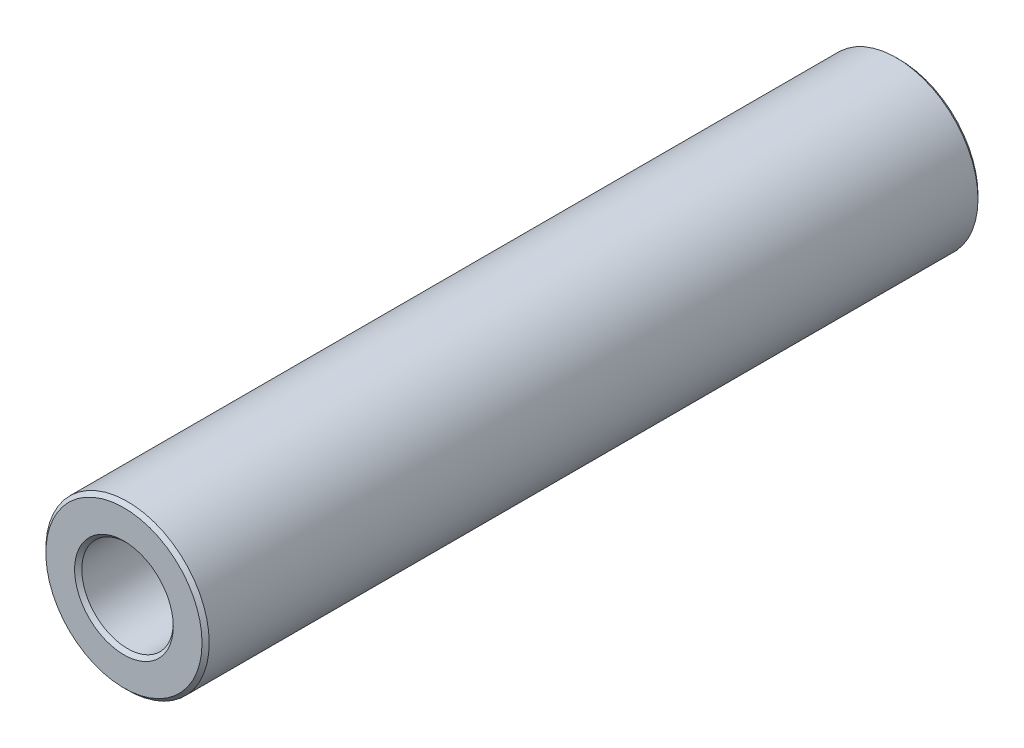
ISO-10303-21;
HEADER;
FILE_DESCRIPTION(('STEP AP214'),'2;1');
FILE_NAME('part.step','',(''),(''),'','','');
FILE_SCHEMA(('AUTOMOTIVE_DESIGN { 1 0 10303 214 1 1 1 1 }'));
ENDSEC;
DATA;
#1=APPLICATION_CONTEXT('core data for automotive mechanical design processes');
#2=APPLICATION_PROTOCOL_DEFINITION('international standard','automotive_design',2000,#1);
#3=PRODUCT_CONTEXT('',#1,'mechanical');
#4=PRODUCT('Part','Part','',(#3));
#5=PRODUCT_RELATED_PRODUCT_CATEGORY('part','',(#4));
#6=PRODUCT_DEFINITION_FORMATION('','',#4);
#7=PRODUCT_DEFINITION_CONTEXT('part definition',#1,'design');
#8=PRODUCT_DEFINITION('design','',#6,#7);
#9=PRODUCT_DEFINITION_SHAPE('','',#8);
#10=(LENGTH_UNIT() NAMED_UNIT(*) SI_UNIT(.MILLI.,.METRE.));
#11=(NAMED_UNIT(*) PLANE_ANGLE_UNIT() SI_UNIT($,.RADIAN.));
#12=(NAMED_UNIT(*) SI_UNIT($,.STERADIAN.) SOLID_ANGLE_UNIT());
#13=UNCERTAINTY_MEASURE_WITH_UNIT(LENGTH_MEASURE(1.E-05),#10,'distance_accuracy_value','');
#14=(GEOMETRIC_REPRESENTATION_CONTEXT(3) GLOBAL_UNCERTAINTY_ASSIGNED_CONTEXT((#13)) GLOBAL_UNIT_ASSIGNED_CONTEXT((#10,
#11,#12)) REPRESENTATION_CONTEXT('',''));
#15=CARTESIAN_POINT('',(0.,0.,0.));
#16=DIRECTION('',(0.,0.,1.));
#17=DIRECTION('',(1.,0.,0.));
#18=AXIS2_PLACEMENT_3D('',#15,#16,#17);
#19=CARTESIAN_POINT('',(0.,0.,-15.08125));
#20=DIRECTION('',(0.,0.,1.));
#21=DIRECTION('',(1.,0.,0.));
#22=AXIS2_PLACEMENT_3D('',#19,#20,#21);
#23=CYLINDRICAL_SURFACE('',#22,3.175);
#24=CARTESIAN_POINT('',(0.,0.,14.94155));
#25=DIRECTION('',(0.,0.,1.));
#26=DIRECTION('',(1.,0.,0.));
#27=AXIS2_PLACEMENT_3D('',#24,#25,#26);
#28=CIRCLE('',#27,3.175);
#29=CARTESIAN_POINT('',(3.175,0.,14.94155));
#30=VERTEX_POINT('',#29);
#31=EDGE_CURVE('E64',#30,#30,#28,.F.);
#32=CARTESIAN_POINT('',(0.,0.,-14.94155));
#33=DIRECTION('',(0.,0.,1.));
#34=DIRECTION('',(1.,0.,0.));
#35=AXIS2_PLACEMENT_3D('',#32,#33,#34);
#36=CIRCLE('',#35,3.175);
#37=CARTESIAN_POINT('',(3.175,0.,-14.94155));
#38=VERTEX_POINT('',#37);
#39=EDGE_CURVE('E68',#38,#38,#36,.T.);
#40=CARTESIAN_POINT('',(3.175,0.,14.94155));
#41=CARTESIAN_POINT('',(3.175,0.,14.6302677083333));
#42=CARTESIAN_POINT('',(3.175,0.,14.3189854166667));
#43=CARTESIAN_POINT('',(3.175,0.,13.6964208333333));
#44=CARTESIAN_POINT('',(3.175,0.,13.3851385416667));
#45=CARTESIAN_POINT('',(3.175,0.,12.7625739583333));
#46=CARTESIAN_POINT('',(3.175,0.,12.4512916666667));
#47=CARTESIAN_POINT('',(3.175,0.,11.8287270833333));
#48=CARTESIAN_POINT('',(3.175,0.,11.5174447916667));
#49=CARTESIAN_POINT('',(3.175,0.,10.8948802083333));
#50=CARTESIAN_POINT('',(3.175,0.,10.5835979166667));
#51=CARTESIAN_POINT('',(3.175,0.,9.96103333333334));
#52=CARTESIAN_POINT('',(3.175,0.,9.64975104166667));
#53=CARTESIAN_POINT('',(3.175,0.,9.02718645833334));
#54=CARTESIAN_POINT('',(3.175,0.,8.71590416666667));
#55=CARTESIAN_POINT('',(3.175,0.,8.09333958333334));
#56=CARTESIAN_POINT('',(3.175,0.,7.78205729166667));
#57=CARTESIAN_POINT('',(3.175,0.,7.15949270833334));
#58=CARTESIAN_POINT('',(3.175,0.,6.84821041666667));
#59=CARTESIAN_POINT('',(3.175,0.,6.22564583333334));
#60=CARTESIAN_POINT('',(3.175,0.,5.91436354166667));
#61=CARTESIAN_POINT('',(3.175,0.,5.29179895833334));
#62=CARTESIAN_POINT('',(3.175,0.,4.98051666666667));
#63=CARTESIAN_POINT('',(3.175,0.,4.35795208333334));
#64=CARTESIAN_POINT('',(3.175,0.,4.04666979166667));
#65=CARTESIAN_POINT('',(3.175,0.,3.42410520833334));
#66=CARTESIAN_POINT('',(3.175,0.,3.11282291666667));
#67=CARTESIAN_POINT('',(3.175,0.,2.49025833333334));
#68=CARTESIAN_POINT('',(3.175,0.,2.17897604166667));
#69=CARTESIAN_POINT('',(3.175,0.,1.55641145833334));
#70=CARTESIAN_POINT('',(3.175,0.,1.24512916666667));
#71=CARTESIAN_POINT('',(3.175,0.,0.622564583333341));
#72=CARTESIAN_POINT('',(3.175,0.,0.311282291666676));
#73=CARTESIAN_POINT('',(3.175,0.,-0.311282291666656));
#74=CARTESIAN_POINT('',(3.175,0.,-0.622564583333322));
#75=CARTESIAN_POINT('',(3.175,0.,-1.24512916666666));
#76=CARTESIAN_POINT('',(3.175,0.,-1.55641145833332));
#77=CARTESIAN_POINT('',(3.175,0.,-2.17897604166666));
#78=CARTESIAN_POINT('',(3.175,0.,-2.49025833333332));
#79=CARTESIAN_POINT('',(3.175,0.,-3.11282291666666));
#80=CARTESIAN_POINT('',(3.175,0.,-3.42410520833332));
#81=CARTESIAN_POINT('',(3.175,0.,-4.04666979166666));
#82=CARTESIAN_POINT('',(3.175,0.,-4.35795208333332));
#83=CARTESIAN_POINT('',(3.175,0.,-4.98051666666665));
#84=CARTESIAN_POINT('',(3.175,0.,-5.29179895833332));
#85=CARTESIAN_POINT('',(3.175,0.,-5.91436354166665));
#86=CARTESIAN_POINT('',(3.175,0.,-6.22564583333332));
#87=CARTESIAN_POINT('',(3.175,0.,-6.84821041666665));
#88=CARTESIAN_POINT('',(3.175,0.,-7.15949270833332));
#89=CARTESIAN_POINT('',(3.175,0.,-7.78205729166665));
#90=CARTESIAN_POINT('',(3.175,0.,-8.09333958333332));
#91=CARTESIAN_POINT('',(3.175,0.,-8.71590416666665));
#92=CARTESIAN_POINT('',(3.175,0.,-9.02718645833332));
#93=CARTESIAN_POINT('',(3.175,0.,-9.64975104166665));
#94=CARTESIAN_POINT('',(3.175,0.,-9.96103333333332));
#95=CARTESIAN_POINT('',(3.175,0.,-10.5835979166666));
#96=CARTESIAN_POINT('',(3.175,0.,-10.8948802083333));
#97=CARTESIAN_POINT('',(3.175,0.,-11.5174447916666));
#98=CARTESIAN_POINT('',(3.175,0.,-11.8287270833333));
#99=CARTESIAN_POINT('',(3.175,0.,-12.4512916666666));
#100=CARTESIAN_POINT('',(3.175,0.,-12.7625739583333));
#101=CARTESIAN_POINT('',(3.175,0.,-13.3851385416666));
#102=CARTESIAN_POINT('',(3.175,0.,-13.6964208333333));
#103=CARTESIAN_POINT('',(3.175,0.,-14.3189854166666));
#104=CARTESIAN_POINT('',(3.175,0.,-14.6302677083333));
#105=CARTESIAN_POINT('',(3.175,0.,-14.94155));
#106=B_SPLINE_CURVE_WITH_KNOTS('',3,(#40,#41,#42,#43,#44,#45,#46,#47,#48,#49,#50,#51,#52,#53,
#54,#55,#56,#57,#58,#59,#60,#61,#62,#63,#64,#65,#66,#67,#68,#69,#70,#71,#72,#73,#74,#75,#76,#77,
#78,#79,#80,#81,#82,#83,#84,#85,#86,#87,#88,#89,#90,#91,#92,#93,#94,#95,#96,#97,#98,#99,#100,
#101,#102,#103,#104,#105),.UNSPECIFIED.,.F.,.F.,(4,2,2,2,2,2,2,2,2,2,2,2,2,2,2,2,2,2,2,2,2,2,2,
2,2,2,2,2,2,2,2,2,4),(0.,0.933846874999998,1.86769375,2.801540625,3.7353875,4.669234375,
5.60308125,6.53692812499999,7.470775,8.404621875,9.33846875,10.272315625,11.2061625,
12.140009375,13.07385625,14.007703125,14.94155,15.875396875,16.80924375,17.743090625,18.6769375,
19.610784375,20.54463125,21.478478125,22.412325,23.346171875,24.28001875,25.213865625,
26.1477125,27.081559375,28.01540625,28.949253125,29.8831),.UNSPECIFIED.);
#107=EDGE_CURVE('BSEAM39',#30,#38,#106,.T.);
#108=ORIENTED_EDGE('',*,*,#31,.T.);
#109=ORIENTED_EDGE('',*,*,#39,.T.);
#110=ORIENTED_EDGE('',*,*,#107,.T.);
#111=ORIENTED_EDGE('',*,*,#107,.F.);
#112=EDGE_LOOP('',(#108,#110,#109,#111));
#113=FACE_BOUND('',#112,.T.);
#114=ADVANCED_FACE('F39',(#113),#23,.T.);
#115=CARTESIAN_POINT('',(0.,0.,-15.08125));
#116=DIRECTION('',(0.,0.,1.));
#117=DIRECTION('',(1.,0.,0.));
#118=AXIS2_PLACEMENT_3D('',#115,#116,#117);
#119=PLANE('',#118);
#120=CARTESIAN_POINT('',(0.,0.,-15.08125));
#121=DIRECTION('',(0.,0.,1.));
#122=DIRECTION('',(1.,0.,0.));
#123=AXIS2_PLACEMENT_3D('',#120,#121,#122);
#124=CIRCLE('',#123,3.03529999999998);
#125=CARTESIAN_POINT('',(3.03529999999998,0.,-15.08125));
#126=VERTEX_POINT('',#125);
#127=EDGE_CURVE('E53',#126,#126,#124,.F.);
#128=ORIENTED_EDGE('',*,*,#127,.T.);
#129=EDGE_LOOP('',(#128));
#130=FACE_BOUND('',#129,.T.);
#131=CARTESIAN_POINT('',(0.,0.,-15.08125));
#132=DIRECTION('',(0.,0.,1.));
#133=DIRECTION('',(1.,0.,0.));
#134=AXIS2_PLACEMENT_3D('',#131,#132,#133);
#135=CIRCLE('',#134,1.91769999999999);
#136=CARTESIAN_POINT('',(1.91769999999999,0.,-15.08125));
#137=VERTEX_POINT('',#136);
#138=EDGE_CURVE('E59',#137,#137,#135,.T.);
#139=ORIENTED_EDGE('',*,*,#138,.T.);
#140=EDGE_LOOP('',(#139));
#141=FACE_BOUND('',#140,.T.);
#142=ADVANCED_FACE('F96',(#130,#141),#119,.F.);
#143=CARTESIAN_POINT('',(0.,0.,-15.08125));
#144=DIRECTION('',(0.,0.,1.));
#145=DIRECTION('',(1.,0.,0.));
#146=AXIS2_PLACEMENT_3D('',#143,#144,#145);
#147=CYLINDRICAL_SURFACE('',#146,1.778);
#148=CARTESIAN_POINT('',(0.,0.,14.94155));
#149=DIRECTION('',(0.,0.,1.));
#150=DIRECTION('',(1.,0.,0.));
#151=AXIS2_PLACEMENT_3D('',#148,#149,#150);
#152=CIRCLE('',#151,1.778);
#153=CARTESIAN_POINT('',(1.778,0.,14.94155));
#154=VERTEX_POINT('',#153);
#155=EDGE_CURVE('E10',#154,#154,#152,.T.);
#156=CARTESIAN_POINT('',(0.,0.,-14.94155));
#157=DIRECTION('',(0.,0.,1.));
#158=DIRECTION('',(1.,0.,0.));
#159=AXIS2_PLACEMENT_3D('',#156,#157,#158);
#160=CIRCLE('',#159,1.778);
#161=CARTESIAN_POINT('',(1.778,0.,-14.94155));
#162=VERTEX_POINT('',#161);
#163=EDGE_CURVE('E47',#162,#162,#160,.F.);
#164=CARTESIAN_POINT('',(1.778,0.,14.94155));
#165=CARTESIAN_POINT('',(1.778,0.,14.6302677083333));
#166=CARTESIAN_POINT('',(1.778,0.,14.3189854166666));
#167=CARTESIAN_POINT('',(1.778,0.,13.6964208333333));
#168=CARTESIAN_POINT('',(1.778,0.,13.3851385416666));
#169=CARTESIAN_POINT('',(1.778,0.,12.7625739583333));
#170=CARTESIAN_POINT('',(1.778,0.,12.4512916666666));
#171=CARTESIAN_POINT('',(1.778,0.,11.8287270833333));
#172=CARTESIAN_POINT('',(1.778,0.,11.5174447916666));
#173=CARTESIAN_POINT('',(1.778,0.,10.8948802083333));
#174=CARTESIAN_POINT('',(1.778,0.,10.5835979166666));
#175=CARTESIAN_POINT('',(1.778,0.,9.9610333333333));
#176=CARTESIAN_POINT('',(1.778,0.,9.64975104166663));
#177=CARTESIAN_POINT('',(1.778,0.,9.0271864583333));
#178=CARTESIAN_POINT('',(1.778,0.,8.71590416666664));
#179=CARTESIAN_POINT('',(1.778,0.,8.0933395833333));
#180=CARTESIAN_POINT('',(1.778,0.,7.78205729166664));
#181=CARTESIAN_POINT('',(1.778,0.,7.1594927083333));
#182=CARTESIAN_POINT('',(1.778,0.,6.84821041666663));
#183=CARTESIAN_POINT('',(1.778,0.,6.2256458333333));
#184=CARTESIAN_POINT('',(1.778,0.,5.91436354166664));
#185=CARTESIAN_POINT('',(1.778,0.,5.2917989583333));
#186=CARTESIAN_POINT('',(1.778,0.,4.98051666666664));
#187=CARTESIAN_POINT('',(1.778,0.,4.35795208333331));
#188=CARTESIAN_POINT('',(1.778,0.,4.04666979166664));
#189=CARTESIAN_POINT('',(1.778,0.,3.42410520833331));
#190=CARTESIAN_POINT('',(1.778,0.,3.11282291666664));
#191=CARTESIAN_POINT('',(1.778,0.,2.49025833333331));
#192=CARTESIAN_POINT('',(1.778,0.,2.17897604166664));
#193=CARTESIAN_POINT('',(1.778,0.,1.55641145833331));
#194=CARTESIAN_POINT('',(1.778,0.,1.24512916666664));
#195=CARTESIAN_POINT('',(1.778,0.,0.622564583333307));
#196=CARTESIAN_POINT('',(1.778,0.,0.311282291666641));
#197=CARTESIAN_POINT('',(1.778,0.,-0.31128229166669));
#198=CARTESIAN_POINT('',(1.778,0.,-0.622564583333356));
#199=CARTESIAN_POINT('',(1.778,0.,-1.24512916666669));
#200=CARTESIAN_POINT('',(1.778,0.,-1.55641145833336));
#201=CARTESIAN_POINT('',(1.778,0.,-2.17897604166669));
#202=CARTESIAN_POINT('',(1.778,0.,-2.49025833333336));
#203=CARTESIAN_POINT('',(1.778,0.,-3.11282291666669));
#204=CARTESIAN_POINT('',(1.778,0.,-3.42410520833336));
#205=CARTESIAN_POINT('',(1.778,0.,-4.04666979166669));
#206=CARTESIAN_POINT('',(1.778,0.,-4.35795208333336));
#207=CARTESIAN_POINT('',(1.778,0.,-4.98051666666669));
#208=CARTESIAN_POINT('',(1.778,0.,-5.29179895833335));
#209=CARTESIAN_POINT('',(1.778,0.,-5.91436354166669));
#210=CARTESIAN_POINT('',(1.778,0.,-6.22564583333335));
#211=CARTESIAN_POINT('',(1.778,0.,-6.84821041666669));
#212=CARTESIAN_POINT('',(1.778,0.,-7.15949270833335));
#213=CARTESIAN_POINT('',(1.778,0.,-7.78205729166668));
#214=CARTESIAN_POINT('',(1.778,0.,-8.09333958333335));
#215=CARTESIAN_POINT('',(1.778,0.,-8.71590416666669));
#216=CARTESIAN_POINT('',(1.778,0.,-9.02718645833335));
#217=CARTESIAN_POINT('',(1.778,0.,-9.64975104166669));
#218=CARTESIAN_POINT('',(1.778,0.,-9.96103333333335));
#219=CARTESIAN_POINT('',(1.778,0.,-10.5835979166667));
#220=CARTESIAN_POINT('',(1.778,0.,-10.8948802083333));
#221=CARTESIAN_POINT('',(1.778,0.,-11.5174447916667));
#222=CARTESIAN_POINT('',(1.778,0.,-11.8287270833333));
#223=CARTESIAN_POINT('',(1.778,0.,-12.4512916666667));
#224=CARTESIAN_POINT('',(1.778,0.,-12.7625739583333));
#225=CARTESIAN_POINT('',(1.778,0.,-13.3851385416667));
#226=CARTESIAN_POINT('',(1.778,0.,-13.6964208333333));
#227=CARTESIAN_POINT('',(1.778,0.,-14.3189854166667));
#228=CARTESIAN_POINT('',(1.778,0.,-14.6302677083333));
#229=CARTESIAN_POINT('',(1.778,0.,-14.94155));
#230=B_SPLINE_CURVE_WITH_KNOTS('',3,(#164,#165,#166,#167,#168,#169,#170,#171,#172,#173,#174,
#175,#176,#177,#178,#179,#180,#181,#182,#183,#184,#185,#186,#187,#188,#189,#190,#191,#192,#193,
#194,#195,#196,#197,#198,#199,#200,#201,#202,#203,#204,#205,#206,#207,#208,#209,#210,#211,#212,
#213,#214,#215,#216,#217,#218,#219,#220,#221,#222,#223,#224,#225,#226,#227,#228,#229),
.UNSPECIFIED.,.F.,.F.,(4,2,2,2,2,2,2,2,2,2,2,2,2,2,2,2,2,2,2,2,2,2,2,2,2,2,2,2,2,2,2,2,4),(0.,
0.933846874999998,1.86769375,2.801540625,3.7353875,4.669234375,5.60308125,6.53692812499999,
7.470775,8.404621875,9.33846875,10.272315625,11.2061625,12.140009375,13.07385625,14.007703125,
14.94155,15.875396875,16.80924375,17.743090625,18.6769375,19.610784375,20.54463125,21.478478125,
22.412325,23.346171875,24.28001875,25.213865625,26.1477125,27.081559375,28.01540625,
28.949253125,29.8831),.UNSPECIFIED.);
#231=EDGE_CURVE('BSEAM102',#154,#162,#230,.T.);
#232=ORIENTED_EDGE('',*,*,#155,.T.);
#233=ORIENTED_EDGE('',*,*,#163,.T.);
#234=ORIENTED_EDGE('',*,*,#231,.T.);
#235=ORIENTED_EDGE('',*,*,#231,.F.);
#236=EDGE_LOOP('',(#232,#234,#233,#235));
#237=FACE_BOUND('',#236,.T.);
#238=ADVANCED_FACE('F102',(#237),#147,.F.);
#239=CARTESIAN_POINT('',(0.,0.,15.08125));
#240=DIRECTION('',(0.,0.,1.));
#241=DIRECTION('',(1.,0.,0.));
#242=AXIS2_PLACEMENT_3D('',#239,#240,#241);
#243=PLANE('',#242);
#244=CARTESIAN_POINT('',(0.,0.,15.08125));
#245=DIRECTION('',(0.,0.,1.));
#246=DIRECTION('',(1.,0.,0.));
#247=AXIS2_PLACEMENT_3D('',#244,#245,#246);
#248=CIRCLE('',#247,3.03530000000001);
#249=CARTESIAN_POINT('',(3.03530000000001,0.,15.08125));
#250=VERTEX_POINT('',#249);
#251=EDGE_CURVE('E72',#250,#250,#248,.T.);
#252=ORIENTED_EDGE('',*,*,#251,.T.);
#253=EDGE_LOOP('',(#252));
#254=FACE_BOUND('',#253,.T.);
#255=CARTESIAN_POINT('',(0.,0.,15.08125));
#256=DIRECTION('',(0.,0.,1.));
#257=DIRECTION('',(1.,0.,0.));
#258=AXIS2_PLACEMENT_3D('',#255,#256,#257);
#259=CIRCLE('',#258,1.91770000000003);
#260=CARTESIAN_POINT('',(1.91770000000003,0.,15.08125));
#261=VERTEX_POINT('',#260);
#262=EDGE_CURVE('E76',#261,#261,#259,.F.);
#263=ORIENTED_EDGE('',*,*,#262,.T.);
#264=EDGE_LOOP('',(#263));
#265=FACE_BOUND('',#264,.T.);
#266=ADVANCED_FACE('F80',(#254,#265),#243,.T.);
#267=CARTESIAN_POINT('',(0.,0.,15.08125));
#268=DIRECTION('',(0.,0.,-1.));
#269=DIRECTION('',(-1.,0.,0.));
#270=AXIS2_PLACEMENT_3D('',#267,#268,#269);
#271=CONICAL_SURFACE('',#270,3.03530000000001,0.785398163397422);
#272=ORIENTED_EDGE('',*,*,#31,.F.);
#273=EDGE_LOOP('',(#272));
#274=FACE_BOUND('',#273,.T.);
#275=ORIENTED_EDGE('',*,*,#251,.F.);
#276=EDGE_LOOP('',(#275));
#277=FACE_BOUND('',#276,.T.);
#278=ADVANCED_FACE('F92',(#274,#277),#271,.T.);
#279=CARTESIAN_POINT('',(0.,0.,-14.94155));
#280=DIRECTION('',(0.,0.,1.));
#281=DIRECTION('',(1.,0.,0.));
#282=AXIS2_PLACEMENT_3D('',#279,#280,#281);
#283=CONICAL_SURFACE('',#282,3.175,0.785398163397447);
#284=ORIENTED_EDGE('',*,*,#127,.F.);
#285=EDGE_LOOP('',(#284));
#286=FACE_BOUND('',#285,.T.);
#287=ORIENTED_EDGE('',*,*,#39,.F.);
#288=EDGE_LOOP('',(#287));
#289=FACE_BOUND('',#288,.T.);
#290=ADVANCED_FACE('F85',(#286,#289),#283,.T.);
#291=CARTESIAN_POINT('',(0.,0.,14.94155));
#292=DIRECTION('',(0.,0.,1.));
#293=DIRECTION('',(1.,0.,0.));
#294=AXIS2_PLACEMENT_3D('',#291,#292,#293);
#295=CONICAL_SURFACE('',#294,1.778,0.785398163397454);
#296=ORIENTED_EDGE('',*,*,#262,.F.);
#297=EDGE_LOOP('',(#296));
#298=FACE_BOUND('',#297,.T.);
#299=ORIENTED_EDGE('',*,*,#155,.F.);
#300=EDGE_LOOP('',(#299));
#301=FACE_BOUND('',#300,.T.);
#302=ADVANCED_FACE('F82',(#298,#301),#295,.F.);
#303=CARTESIAN_POINT('',(0.,0.,-15.08125));
#304=DIRECTION('',(0.,0.,-1.));
#305=DIRECTION('',(-1.,0.,0.));
#306=AXIS2_PLACEMENT_3D('',#303,#304,#305);
#307=CONICAL_SURFACE('',#306,1.91769999999999,0.785398163397453);
#308=ORIENTED_EDGE('',*,*,#163,.F.);
#309=EDGE_LOOP('',(#308));
#310=FACE_BOUND('',#309,.T.);
#311=ORIENTED_EDGE('',*,*,#138,.F.);
#312=EDGE_LOOP('',(#311));
#313=FACE_BOUND('',#312,.T.);
#314=ADVANCED_FACE('F41',(#310,#313),#307,.F.);
#315=CLOSED_SHELL('',(#114,#142,#238,#266,#278,#290,#302,#314));
#316=MANIFOLD_SOLID_BREP('B2',#315);
#317=ADVANCED_BREP_SHAPE_REPRESENTATION('',(#18,#316),#14);
#318=SHAPE_DEFINITION_REPRESENTATION(#9,#317);
ENDSEC;
END-ISO-10303-21;
